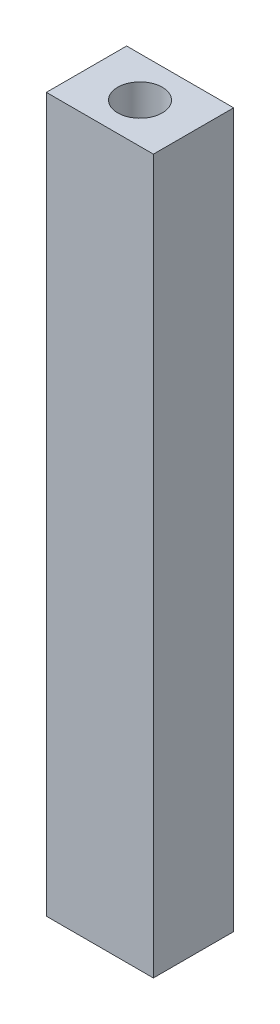
ISO-10303-21;
HEADER;
FILE_DESCRIPTION(('STEP AP214'),'2;1');
FILE_NAME('part.step','',(''),(''),'','','');
FILE_SCHEMA(('AUTOMOTIVE_DESIGN { 1 0 10303 214 1 1 1 1 }'));
ENDSEC;
DATA;
#1=APPLICATION_CONTEXT('core data for automotive mechanical design processes');
#2=APPLICATION_PROTOCOL_DEFINITION('international standard','automotive_design',2000,#1);
#3=PRODUCT_CONTEXT('',#1,'mechanical');
#4=PRODUCT('Part','Part','',(#3));
#5=PRODUCT_RELATED_PRODUCT_CATEGORY('part','',(#4));
#6=PRODUCT_DEFINITION_FORMATION('','',#4);
#7=PRODUCT_DEFINITION_CONTEXT('part definition',#1,'design');
#8=PRODUCT_DEFINITION('design','',#6,#7);
#9=PRODUCT_DEFINITION_SHAPE('','',#8);
#10=(LENGTH_UNIT() NAMED_UNIT(*) SI_UNIT(.MILLI.,.METRE.));
#11=(NAMED_UNIT(*) PLANE_ANGLE_UNIT() SI_UNIT($,.RADIAN.));
#12=(NAMED_UNIT(*) SI_UNIT($,.STERADIAN.) SOLID_ANGLE_UNIT());
#13=UNCERTAINTY_MEASURE_WITH_UNIT(LENGTH_MEASURE(1.E-05),#10,'distance_accuracy_value','');
#14=(GEOMETRIC_REPRESENTATION_CONTEXT(3) GLOBAL_UNCERTAINTY_ASSIGNED_CONTEXT((#13)) GLOBAL_UNIT_ASSIGNED_CONTEXT((#10,
#11,#12)) REPRESENTATION_CONTEXT('',''));
#15=CARTESIAN_POINT('',(0.,0.,0.));
#16=DIRECTION('',(0.,0.,1.));
#17=DIRECTION('',(1.,0.,0.));
#18=AXIS2_PLACEMENT_3D('',#15,#16,#17);
#19=CARTESIAN_POINT('',(6.,80.,4.5));
#20=DIRECTION('',(-1.,0.,0.));
#21=DIRECTION('',(0.,0.,1.));
#22=AXIS2_PLACEMENT_3D('',#19,#20,#21);
#23=PLANE('',#22);
#24=DIRECTION('',(0.,0.,-1.));
#25=VECTOR('',#24,1.);
#26=CARTESIAN_POINT('',(6.,0.,4.5));
#27=LINE('',#26,#25);
#28=CARTESIAN_POINT('',(6.,0.,4.5));
#29=VERTEX_POINT('',#28);
#30=CARTESIAN_POINT('',(6.,0.,-4.5));
#31=VERTEX_POINT('',#30);
#32=EDGE_CURVE('E114',#29,#31,#27,.T.);
#33=ORIENTED_EDGE('',*,*,#32,.T.);
#34=DIRECTION('',(0.,-1.,0.));
#35=VECTOR('',#34,1.);
#36=CARTESIAN_POINT('',(6.,80.,-4.5));
#37=LINE('',#36,#35);
#38=CARTESIAN_POINT('',(6.,80.,-4.5));
#39=VERTEX_POINT('',#38);
#40=EDGE_CURVE('E13',#39,#31,#37,.T.);
#41=ORIENTED_EDGE('',*,*,#40,.F.);
#42=DIRECTION('',(0.,0.,-1.));
#43=VECTOR('',#42,1.);
#44=CARTESIAN_POINT('',(6.,80.,4.5));
#45=LINE('',#44,#43);
#46=CARTESIAN_POINT('',(6.,80.,4.5));
#47=VERTEX_POINT('',#46);
#48=EDGE_CURVE('E102',#47,#39,#45,.T.);
#49=ORIENTED_EDGE('',*,*,#48,.F.);
#50=DIRECTION('',(0.,-1.,0.));
#51=VECTOR('',#50,1.);
#52=CARTESIAN_POINT('',(6.,80.,4.5));
#53=LINE('',#52,#51);
#54=EDGE_CURVE('E110',#47,#29,#53,.T.);
#55=ORIENTED_EDGE('',*,*,#54,.T.);
#56=EDGE_LOOP('',(#33,#41,#49,#55));
#57=FACE_BOUND('',#56,.T.);
#58=ADVANCED_FACE('F51',(#57),#23,.F.);
#59=CARTESIAN_POINT('',(-6.,80.,-4.5));
#60=DIRECTION('',(0.,0.,1.));
#61=DIRECTION('',(1.,0.,0.));
#62=AXIS2_PLACEMENT_3D('',#59,#60,#61);
#63=PLANE('',#62);
#64=DIRECTION('',(-1.,0.,0.));
#65=VECTOR('',#64,1.);
#66=CARTESIAN_POINT('',(-6.,0.,-4.5));
#67=LINE('',#66,#65);
#68=CARTESIAN_POINT('',(-6.,0.,-4.5));
#69=VERTEX_POINT('',#68);
#70=EDGE_CURVE('E106',#31,#69,#67,.T.);
#71=ORIENTED_EDGE('',*,*,#70,.T.);
#72=DIRECTION('',(0.,-1.,0.));
#73=VECTOR('',#72,1.);
#74=CARTESIAN_POINT('',(-6.,80.,-4.5));
#75=LINE('',#74,#73);
#76=CARTESIAN_POINT('',(-6.,80.,-4.5));
#77=VERTEX_POINT('',#76);
#78=EDGE_CURVE('E59',#77,#69,#75,.T.);
#79=ORIENTED_EDGE('',*,*,#78,.F.);
#80=DIRECTION('',(-1.,0.,0.));
#81=VECTOR('',#80,1.);
#82=CARTESIAN_POINT('',(-6.,80.,-4.5));
#83=LINE('',#82,#81);
#84=EDGE_CURVE('E97',#39,#77,#83,.T.);
#85=ORIENTED_EDGE('',*,*,#84,.F.);
#86=ORIENTED_EDGE('',*,*,#40,.T.);
#87=EDGE_LOOP('',(#71,#79,#85,#86));
#88=FACE_BOUND('',#87,.T.);
#89=ADVANCED_FACE('F105',(#88),#63,.F.);
#90=CARTESIAN_POINT('',(-6.,80.,4.5));
#91=DIRECTION('',(1.,0.,0.));
#92=DIRECTION('',(0.,0.,-1.));
#93=AXIS2_PLACEMENT_3D('',#90,#91,#92);
#94=PLANE('',#93);
#95=DIRECTION('',(0.,0.,1.));
#96=VECTOR('',#95,1.);
#97=CARTESIAN_POINT('',(-6.,0.,4.5));
#98=LINE('',#97,#96);
#99=CARTESIAN_POINT('',(-6.,0.,4.5));
#100=VERTEX_POINT('',#99);
#101=EDGE_CURVE('E84',#69,#100,#98,.T.);
#102=ORIENTED_EDGE('',*,*,#101,.T.);
#103=DIRECTION('',(0.,-1.,0.));
#104=VECTOR('',#103,1.);
#105=CARTESIAN_POINT('',(-6.,80.,4.5));
#106=LINE('',#105,#104);
#107=CARTESIAN_POINT('',(-6.,80.,4.5));
#108=VERTEX_POINT('',#107);
#109=EDGE_CURVE('E107',#108,#100,#106,.T.);
#110=ORIENTED_EDGE('',*,*,#109,.F.);
#111=DIRECTION('',(0.,0.,1.));
#112=VECTOR('',#111,1.);
#113=CARTESIAN_POINT('',(-6.,80.,4.5));
#114=LINE('',#113,#112);
#115=EDGE_CURVE('E100',#77,#108,#114,.T.);
#116=ORIENTED_EDGE('',*,*,#115,.F.);
#117=ORIENTED_EDGE('',*,*,#78,.T.);
#118=EDGE_LOOP('',(#102,#110,#116,#117));
#119=FACE_BOUND('',#118,.T.);
#120=ADVANCED_FACE('F108',(#119),#94,.F.);
#121=CARTESIAN_POINT('',(-6.,80.,4.5));
#122=DIRECTION('',(0.,0.,-1.));
#123=DIRECTION('',(-1.,0.,0.));
#124=AXIS2_PLACEMENT_3D('',#121,#122,#123);
#125=PLANE('',#124);
#126=DIRECTION('',(1.,0.,0.));
#127=VECTOR('',#126,1.);
#128=CARTESIAN_POINT('',(-6.,0.,4.5));
#129=LINE('',#128,#127);
#130=EDGE_CURVE('E90',#100,#29,#129,.T.);
#131=ORIENTED_EDGE('',*,*,#130,.T.);
#132=ORIENTED_EDGE('',*,*,#54,.F.);
#133=DIRECTION('',(1.,0.,0.));
#134=VECTOR('',#133,1.);
#135=CARTESIAN_POINT('',(-6.,80.,4.5));
#136=LINE('',#135,#134);
#137=EDGE_CURVE('E67',#108,#47,#136,.T.);
#138=ORIENTED_EDGE('',*,*,#137,.F.);
#139=ORIENTED_EDGE('',*,*,#109,.T.);
#140=EDGE_LOOP('',(#131,#132,#138,#139));
#141=FACE_BOUND('',#140,.T.);
#142=ADVANCED_FACE('F122',(#141),#125,.F.);
#143=CARTESIAN_POINT('',(0.,80.,0.));
#144=DIRECTION('',(0.,-1.,0.));
#145=DIRECTION('',(0.,0.,-1.));
#146=AXIS2_PLACEMENT_3D('',#143,#144,#145);
#147=PLANE('',#146);
#148=CARTESIAN_POINT('',(0.,80.,0.));
#149=DIRECTION('',(0.,1.,0.));
#150=DIRECTION('',(0.,0.,1.));
#151=AXIS2_PLACEMENT_3D('',#148,#149,#150);
#152=CIRCLE('',#151,2.5);
#153=CARTESIAN_POINT('',(0.,80.,2.5));
#154=VERTEX_POINT('',#153);
#155=EDGE_CURVE('E134',#154,#154,#152,.T.);
#156=ORIENTED_EDGE('',*,*,#155,.F.);
#157=EDGE_LOOP('',(#156));
#158=FACE_BOUND('',#157,.T.);
#159=ORIENTED_EDGE('',*,*,#48,.T.);
#160=ORIENTED_EDGE('',*,*,#84,.T.);
#161=ORIENTED_EDGE('',*,*,#115,.T.);
#162=ORIENTED_EDGE('',*,*,#137,.T.);
#163=EDGE_LOOP('',(#159,#160,#161,#162));
#164=FACE_BOUND('',#163,.T.);
#165=ADVANCED_FACE('F98',(#158,#164),#147,.F.);
#166=CARTESIAN_POINT('',(0.,0.,0.));
#167=DIRECTION('',(0.,-1.,0.));
#168=DIRECTION('',(0.,0.,-1.));
#169=AXIS2_PLACEMENT_3D('',#166,#167,#168);
#170=PLANE('',#169);
#171=CARTESIAN_POINT('',(0.,0.,0.));
#172=DIRECTION('',(0.,-1.,0.));
#173=DIRECTION('',(0.,0.,-1.));
#174=AXIS2_PLACEMENT_3D('',#171,#172,#173);
#175=CIRCLE('',#174,3.);
#176=CARTESIAN_POINT('',(0.,0.,-3.));
#177=VERTEX_POINT('',#176);
#178=EDGE_CURVE('E128',#177,#177,#175,.T.);
#179=ORIENTED_EDGE('',*,*,#178,.F.);
#180=EDGE_LOOP('',(#179));
#181=FACE_BOUND('',#180,.T.);
#182=ORIENTED_EDGE('',*,*,#32,.F.);
#183=ORIENTED_EDGE('',*,*,#130,.F.);
#184=ORIENTED_EDGE('',*,*,#101,.F.);
#185=ORIENTED_EDGE('',*,*,#70,.F.);
#186=EDGE_LOOP('',(#182,#183,#184,#185));
#187=FACE_BOUND('',#186,.T.);
#188=ADVANCED_FACE('F125',(#181,#187),#170,.T.);
#189=CARTESIAN_POINT('',(0.,15.,0.));
#190=DIRECTION('',(0.,-1.,0.));
#191=DIRECTION('',(0.,0.,-1.));
#192=AXIS2_PLACEMENT_3D('',#189,#190,#191);
#193=CYLINDRICAL_SURFACE('',#192,3.);
#194=CARTESIAN_POINT('',(0.,15.,0.));
#195=DIRECTION('',(0.,-1.,0.));
#196=DIRECTION('',(0.,0.,-1.));
#197=AXIS2_PLACEMENT_3D('',#194,#195,#196);
#198=CIRCLE('',#197,3.);
#199=CARTESIAN_POINT('',(0.,15.,-3.));
#200=VERTEX_POINT('',#199);
#201=EDGE_CURVE('E117',#200,#200,#198,.T.);
#202=ORIENTED_EDGE('',*,*,#201,.F.);
#203=EDGE_LOOP('',(#202));
#204=FACE_BOUND('',#203,.T.);
#205=ORIENTED_EDGE('',*,*,#178,.T.);
#206=EDGE_LOOP('',(#205));
#207=FACE_BOUND('',#206,.T.);
#208=ADVANCED_FACE('F155',(#204,#207),#193,.F.);
#209=CARTESIAN_POINT('',(0.,15.,0.));
#210=DIRECTION('',(0.,-1.,0.));
#211=DIRECTION('',(0.,0.,-1.));
#212=AXIS2_PLACEMENT_3D('',#209,#210,#211);
#213=PLANE('',#212);
#214=ORIENTED_EDGE('',*,*,#201,.T.);
#215=EDGE_LOOP('',(#214));
#216=FACE_BOUND('',#215,.T.);
#217=ADVANCED_FACE('F145',(#216),#213,.T.);
#218=CARTESIAN_POINT('',(0.,65.,0.));
#219=DIRECTION('',(0.,1.,0.));
#220=DIRECTION('',(0.,0.,1.));
#221=AXIS2_PLACEMENT_3D('',#218,#219,#220);
#222=CYLINDRICAL_SURFACE('',#221,2.5);
#223=CARTESIAN_POINT('',(0.,65.,0.));
#224=DIRECTION('',(0.,1.,0.));
#225=DIRECTION('',(0.,0.,1.));
#226=AXIS2_PLACEMENT_3D('',#223,#224,#225);
#227=CIRCLE('',#226,2.5);
#228=CARTESIAN_POINT('',(0.,65.,2.5));
#229=VERTEX_POINT('',#228);
#230=EDGE_CURVE('E131',#229,#229,#227,.T.);
#231=ORIENTED_EDGE('',*,*,#230,.F.);
#232=EDGE_LOOP('',(#231));
#233=FACE_BOUND('',#232,.T.);
#234=ORIENTED_EDGE('',*,*,#155,.T.);
#235=EDGE_LOOP('',(#234));
#236=FACE_BOUND('',#235,.T.);
#237=ADVANCED_FACE('F142',(#233,#236),#222,.F.);
#238=CARTESIAN_POINT('',(0.,65.,0.));
#239=DIRECTION('',(0.,1.,0.));
#240=DIRECTION('',(0.,0.,1.));
#241=AXIS2_PLACEMENT_3D('',#238,#239,#240);
#242=PLANE('',#241);
#243=ORIENTED_EDGE('',*,*,#230,.T.);
#244=EDGE_LOOP('',(#243));
#245=FACE_BOUND('',#244,.T.);
#246=ADVANCED_FACE('F140',(#245),#242,.T.);
#247=CLOSED_SHELL('',(#58,#89,#120,#142,#165,#188,#208,#217,#237,#246));
#248=MANIFOLD_SOLID_BREP('B2',#247);
#249=ADVANCED_BREP_SHAPE_REPRESENTATION('',(#18,#248),#14);
#250=SHAPE_DEFINITION_REPRESENTATION(#9,#249);
ENDSEC;
END-ISO-10303-21;
